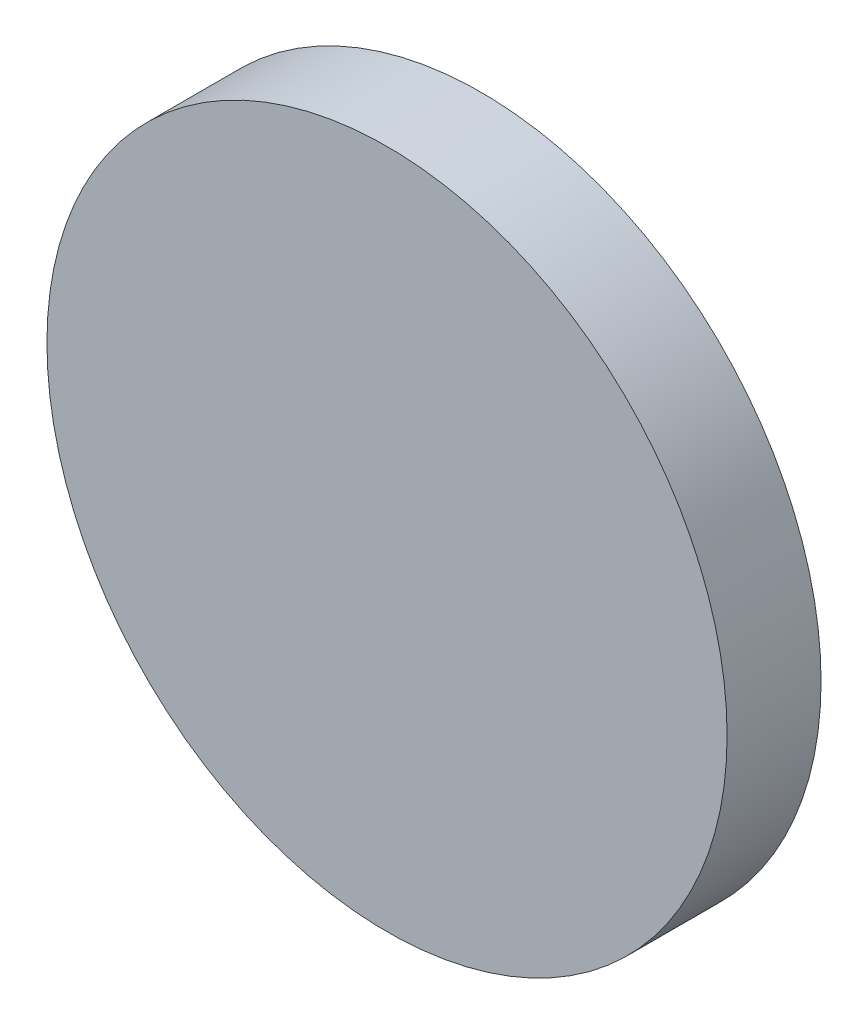
ISO-10303-21;
HEADER;
FILE_DESCRIPTION(('STEP AP214'),'2;1');
FILE_NAME('part.step','',(''),(''),'','','');
FILE_SCHEMA(('AUTOMOTIVE_DESIGN { 1 0 10303 214 1 1 1 1 }'));
ENDSEC;
DATA;
#1=APPLICATION_CONTEXT('core data for automotive mechanical design processes');
#2=APPLICATION_PROTOCOL_DEFINITION('international standard','automotive_design',2000,#1);
#3=PRODUCT_CONTEXT('',#1,'mechanical');
#4=PRODUCT('Part','Part','',(#3));
#5=PRODUCT_RELATED_PRODUCT_CATEGORY('part','',(#4));
#6=PRODUCT_DEFINITION_FORMATION('','',#4);
#7=PRODUCT_DEFINITION_CONTEXT('part definition',#1,'design');
#8=PRODUCT_DEFINITION('design','',#6,#7);
#9=PRODUCT_DEFINITION_SHAPE('','',#8);
#10=(LENGTH_UNIT() NAMED_UNIT(*) SI_UNIT(.MILLI.,.METRE.));
#11=(NAMED_UNIT(*) PLANE_ANGLE_UNIT() SI_UNIT($,.RADIAN.));
#12=(NAMED_UNIT(*) SI_UNIT($,.STERADIAN.) SOLID_ANGLE_UNIT());
#13=UNCERTAINTY_MEASURE_WITH_UNIT(LENGTH_MEASURE(1.E-05),#10,'distance_accuracy_value','');
#14=(GEOMETRIC_REPRESENTATION_CONTEXT(3) GLOBAL_UNCERTAINTY_ASSIGNED_CONTEXT((#13)) GLOBAL_UNIT_ASSIGNED_CONTEXT((#10,
#11,#12)) REPRESENTATION_CONTEXT('',''));
#15=CARTESIAN_POINT('',(0.,0.,0.));
#16=DIRECTION('',(0.,0.,1.));
#17=DIRECTION('',(1.,0.,0.));
#18=AXIS2_PLACEMENT_3D('',#15,#16,#17);
#19=CARTESIAN_POINT('',(0.,0.,3.175));
#20=DIRECTION('',(0.,0.,-1.));
#21=DIRECTION('',(-1.,0.,0.));
#22=AXIS2_PLACEMENT_3D('',#19,#20,#21);
#23=CYLINDRICAL_SURFACE('',#22,11.4935);
#24=CARTESIAN_POINT('',(0.,0.,3.175));
#25=DIRECTION('',(0.,0.,1.));
#26=DIRECTION('',(1.,0.,0.));
#27=AXIS2_PLACEMENT_3D('',#24,#25,#26);
#28=CIRCLE('',#27,11.4935);
#29=CARTESIAN_POINT('',(11.4935,0.,3.175));
#30=VERTEX_POINT('',#29);
#31=EDGE_CURVE('E11',#30,#30,#28,.T.);
#32=ORIENTED_EDGE('',*,*,#31,.F.);
#33=EDGE_LOOP('',(#32));
#34=FACE_BOUND('',#33,.T.);
#35=CARTESIAN_POINT('',(0.,0.,0.));
#36=DIRECTION('',(0.,0.,1.));
#37=DIRECTION('',(1.,0.,0.));
#38=AXIS2_PLACEMENT_3D('',#35,#36,#37);
#39=CIRCLE('',#38,11.4935);
#40=CARTESIAN_POINT('',(11.4935,0.,0.));
#41=VERTEX_POINT('',#40);
#42=EDGE_CURVE('E40',#41,#41,#39,.T.);
#43=ORIENTED_EDGE('',*,*,#42,.T.);
#44=EDGE_LOOP('',(#43));
#45=FACE_BOUND('',#44,.T.);
#46=ADVANCED_FACE('F37',(#34,#45),#23,.T.);
#47=CARTESIAN_POINT('',(0.,0.,3.175));
#48=DIRECTION('',(0.,0.,1.));
#49=DIRECTION('',(1.,0.,0.));
#50=AXIS2_PLACEMENT_3D('',#47,#48,#49);
#51=PLANE('',#50);
#52=ORIENTED_EDGE('',*,*,#31,.T.);
#53=EDGE_LOOP('',(#52));
#54=FACE_BOUND('',#53,.T.);
#55=ADVANCED_FACE('F54',(#54),#51,.T.);
#56=CARTESIAN_POINT('',(0.,0.,0.));
#57=DIRECTION('',(0.,0.,1.));
#58=DIRECTION('',(1.,0.,0.));
#59=AXIS2_PLACEMENT_3D('',#56,#57,#58);
#60=PLANE('',#59);
#61=ORIENTED_EDGE('',*,*,#42,.F.);
#62=EDGE_LOOP('',(#61));
#63=FACE_BOUND('',#62,.T.);
#64=ADVANCED_FACE('F52',(#63),#60,.F.);
#65=CLOSED_SHELL('',(#46,#55,#64));
#66=MANIFOLD_SOLID_BREP('B2',#65);
#67=ADVANCED_BREP_SHAPE_REPRESENTATION('',(#18,#66),#14);
#68=SHAPE_DEFINITION_REPRESENTATION(#9,#67);
ENDSEC;
END-ISO-10303-21;
